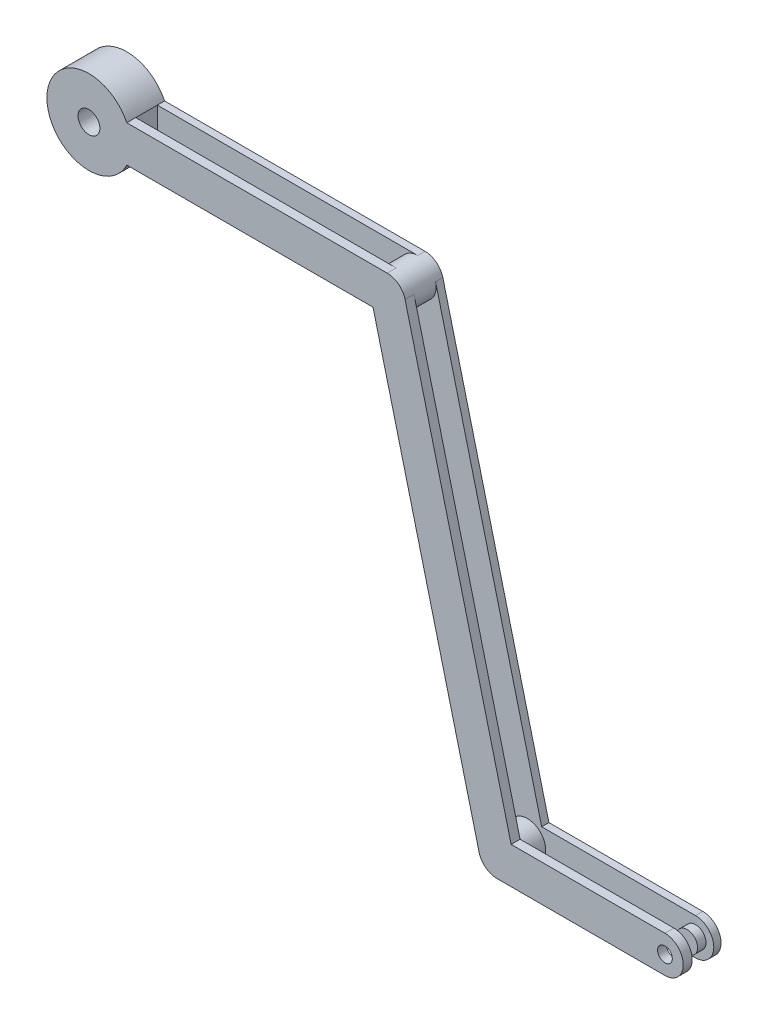
ISO-10303-21;
HEADER;
FILE_DESCRIPTION(('STEP AP214'),'2;1');
FILE_NAME('part.step','',(''),(''),'','','');
FILE_SCHEMA(('AUTOMOTIVE_DESIGN { 1 0 10303 214 1 1 1 1 }'));
ENDSEC;
DATA;
#1=APPLICATION_CONTEXT('core data for automotive mechanical design processes');
#2=APPLICATION_PROTOCOL_DEFINITION('international standard','automotive_design',2000,#1);
#3=PRODUCT_CONTEXT('',#1,'mechanical');
#4=PRODUCT('Part','Part','',(#3));
#5=PRODUCT_RELATED_PRODUCT_CATEGORY('part','',(#4));
#6=PRODUCT_DEFINITION_FORMATION('','',#4);
#7=PRODUCT_DEFINITION_CONTEXT('part definition',#1,'design');
#8=PRODUCT_DEFINITION('design','',#6,#7);
#9=PRODUCT_DEFINITION_SHAPE('','',#8);
#10=(LENGTH_UNIT() NAMED_UNIT(*) SI_UNIT(.MILLI.,.METRE.));
#11=(NAMED_UNIT(*) PLANE_ANGLE_UNIT() SI_UNIT($,.RADIAN.));
#12=(NAMED_UNIT(*) SI_UNIT($,.STERADIAN.) SOLID_ANGLE_UNIT());
#13=UNCERTAINTY_MEASURE_WITH_UNIT(LENGTH_MEASURE(1.E-05),#10,'distance_accuracy_value','');
#14=(GEOMETRIC_REPRESENTATION_CONTEXT(3) GLOBAL_UNCERTAINTY_ASSIGNED_CONTEXT((#13)) GLOBAL_UNIT_ASSIGNED_CONTEXT((#10,
#11,#12)) REPRESENTATION_CONTEXT('',''));
#15=CARTESIAN_POINT('',(0.,0.,0.));
#16=DIRECTION('',(0.,0.,1.));
#17=DIRECTION('',(1.,0.,0.));
#18=AXIS2_PLACEMENT_3D('',#15,#16,#17);
#19=CARTESIAN_POINT('',(0.,-107.358898943541,9.));
#20=DIRECTION('',(0.,1.,0.));
#21=DIRECTION('',(0.,0.,1.));
#22=AXIS2_PLACEMENT_3D('',#19,#20,#21);
#23=PLANE('',#22);
#24=DIRECTION('',(0.,0.,-1.));
#25=VECTOR('',#24,1.);
#26=CARTESIAN_POINT('',(137.080968946948,-107.358898943541,9.));
#27=LINE('',#26,#25);
#28=CARTESIAN_POINT('',(137.080968946948,-107.358898943541,1.72985231859176));
#29=VERTEX_POINT('',#28);
#30=CARTESIAN_POINT('',(137.080968946948,-107.358898943541,0.));
#31=VERTEX_POINT('',#30);
#32=EDGE_CURVE('E249',#29,#31,#27,.T.);
#33=ORIENTED_EDGE('',*,*,#32,.F.);
#34=DIRECTION('',(-1.,0.,0.));
#35=VECTOR('',#34,1.);
#36=CARTESIAN_POINT('',(141.439867890489,-107.358898943541,1.72985231859176));
#37=LINE('',#36,#35);
#38=CARTESIAN_POINT('',(97.0809689469479,-107.358898943541,1.72985231859176));
#39=VERTEX_POINT('',#38);
#40=EDGE_CURVE('E332',#29,#39,#37,.T.);
#41=ORIENTED_EDGE('',*,*,#40,.T.);
#42=DIRECTION('',(0.,0.,-1.));
#43=VECTOR('',#42,1.);
#44=CARTESIAN_POINT('',(97.0809689469479,-107.358898943541,9.));
#45=LINE('',#44,#43);
#46=CARTESIAN_POINT('',(97.0809689469479,-107.358898943541,0.));
#47=VERTEX_POINT('',#46);
#48=EDGE_CURVE('E109',#39,#47,#45,.T.);
#49=ORIENTED_EDGE('',*,*,#48,.T.);
#50=DIRECTION('',(1.,0.,0.));
#51=VECTOR('',#50,1.);
#52=CARTESIAN_POINT('',(0.,-107.358898943541,0.));
#53=LINE('',#52,#51);
#54=EDGE_CURVE('E175',#47,#31,#53,.T.);
#55=ORIENTED_EDGE('',*,*,#54,.T.);
#56=EDGE_LOOP('',(#33,#41,#49,#55));
#57=FACE_BOUND('',#56,.T.);
#58=ADVANCED_FACE('F47',(#57),#23,.F.);
#59=CARTESIAN_POINT('',(137.080968946948,-103.,9.));
#60=DIRECTION('',(0.,0.,-1.));
#61=DIRECTION('',(-1.,0.,0.));
#62=AXIS2_PLACEMENT_3D('',#59,#60,#61);
#63=CYLINDRICAL_SURFACE('',#62,4.35889894354068);
#64=CARTESIAN_POINT('',(137.080968946948,-103.,1.72985231859176));
#65=DIRECTION('',(0.,0.,-1.));
#66=DIRECTION('',(-1.,0.,0.));
#67=AXIS2_PLACEMENT_3D('',#64,#65,#66);
#68=CIRCLE('',#67,4.35889894354068);
#69=CARTESIAN_POINT('',(137.080968946948,-98.6411010564593,1.72985231859176));
#70=VERTEX_POINT('',#69);
#71=EDGE_CURVE('E377',#70,#29,#68,.T.);
#72=ORIENTED_EDGE('',*,*,#71,.T.);
#73=ORIENTED_EDGE('',*,*,#32,.T.);
#74=CARTESIAN_POINT('',(137.080968946948,-103.,0.));
#75=DIRECTION('',(0.,0.,1.));
#76=DIRECTION('',(1.,0.,0.));
#77=AXIS2_PLACEMENT_3D('',#74,#75,#76);
#78=CIRCLE('',#77,4.35889894354068);
#79=CARTESIAN_POINT('',(137.080968946948,-98.6411010564593,0.));
#80=VERTEX_POINT('',#79);
#81=EDGE_CURVE('E178',#31,#80,#78,.T.);
#82=ORIENTED_EDGE('',*,*,#81,.T.);
#83=DIRECTION('',(0.,0.,-1.));
#84=VECTOR('',#83,1.);
#85=CARTESIAN_POINT('',(137.080968946948,-98.6411010564593,9.));
#86=LINE('',#85,#84);
#87=EDGE_CURVE('E244',#70,#80,#86,.T.);
#88=ORIENTED_EDGE('',*,*,#87,.F.);
#89=EDGE_LOOP('',(#72,#73,#82,#88));
#90=FACE_BOUND('',#89,.T.);
#91=ADVANCED_FACE('F453',(#90),#63,.T.);
#92=CARTESIAN_POINT('',(0.,-98.6411010564593,9.));
#93=DIRECTION('',(0.,1.,0.));
#94=DIRECTION('',(0.,0.,1.));
#95=AXIS2_PLACEMENT_3D('',#92,#93,#94);
#96=PLANE('',#95);
#97=DIRECTION('',(-1.,0.,0.));
#98=VECTOR('',#97,1.);
#99=CARTESIAN_POINT('',(0.,-98.6411010564593,1.72985231859176));
#100=LINE('',#99,#98);
#101=CARTESIAN_POINT('',(100.473705575307,-98.6411010564593,1.72985231859176));
#102=VERTEX_POINT('',#101);
#103=EDGE_CURVE('E373',#70,#102,#100,.T.);
#104=ORIENTED_EDGE('',*,*,#103,.F.);
#105=ORIENTED_EDGE('',*,*,#87,.T.);
#106=DIRECTION('',(1.,0.,0.));
#107=VECTOR('',#106,1.);
#108=CARTESIAN_POINT('',(0.,-98.6411010564593,0.));
#109=LINE('',#108,#107);
#110=CARTESIAN_POINT('',(100.473705575307,-98.6411010564593,0.));
#111=VERTEX_POINT('',#110);
#112=EDGE_CURVE('E183',#111,#80,#109,.T.);
#113=ORIENTED_EDGE('',*,*,#112,.F.);
#114=DIRECTION('',(0.,0.,-1.));
#115=VECTOR('',#114,1.);
#116=CARTESIAN_POINT('',(100.473705575307,-98.6411010564593,9.));
#117=LINE('',#116,#115);
#118=EDGE_CURVE('E239',#102,#111,#117,.T.);
#119=ORIENTED_EDGE('',*,*,#118,.F.);
#120=EDGE_LOOP('',(#104,#105,#113,#119));
#121=FACE_BOUND('',#120,.T.);
#122=ADVANCED_FACE('F451',(#121),#96,.T.);
#123=CARTESIAN_POINT('',(70.9475272540212,17.9648568463579,9.));
#124=DIRECTION('',(0.969405133703911,0.245466263972268,0.));
#125=DIRECTION('',(-0.245466263972268,0.969405133703911,0.));
#126=AXIS2_PLACEMENT_3D('',#123,#124,#125);
#127=PLANE('',#126);
#128=DIRECTION('',(-0.245466263972268,0.969405133703911,0.));
#129=VECTOR('',#128,1.);
#130=CARTESIAN_POINT('',(70.9475272540212,17.9648568463579,1.72985231859176));
#131=LINE('',#130,#129);
#132=CARTESIAN_POINT('',(75.2255390131649,1.0699626387036,1.72985231859176));
#133=VERTEX_POINT('',#132);
#134=EDGE_CURVE('E369',#102,#133,#131,.T.);
#135=ORIENTED_EDGE('',*,*,#134,.F.);
#136=ORIENTED_EDGE('',*,*,#118,.T.);
#137=DIRECTION('',(0.245466263972268,-0.969405133703911,0.));
#138=VECTOR('',#137,1.);
#139=CARTESIAN_POINT('',(70.9475272540212,17.9648568463579,0.));
#140=LINE('',#139,#138);
#141=CARTESIAN_POINT('',(75.2255390131649,1.0699626387036,0.));
#142=VERTEX_POINT('',#141);
#143=EDGE_CURVE('E187',#142,#111,#140,.T.);
#144=ORIENTED_EDGE('',*,*,#143,.F.);
#145=DIRECTION('',(0.,0.,-1.));
#146=VECTOR('',#145,1.);
#147=CARTESIAN_POINT('',(75.2255390131649,1.0699626387036,9.));
#148=LINE('',#147,#146);
#149=EDGE_CURVE('E234',#133,#142,#148,.T.);
#150=ORIENTED_EDGE('',*,*,#149,.F.);
#151=EDGE_LOOP('',(#135,#136,#144,#150));
#152=FACE_BOUND('',#151,.T.);
#153=ADVANCED_FACE('F445',(#152),#127,.T.);
#154=CARTESIAN_POINT('',(0.,4.35889894354067,9.));
#155=DIRECTION('',(0.,1.,0.));
#156=DIRECTION('',(0.,0.,1.));
#157=AXIS2_PLACEMENT_3D('',#154,#155,#156);
#158=PLANE('',#157);
#159=DIRECTION('',(-1.,0.,0.));
#160=VECTOR('',#159,1.);
#161=CARTESIAN_POINT('',(141.439867890489,4.35889894354067,1.72985231859176));
#162=LINE('',#161,#160);
#163=CARTESIAN_POINT('',(71.,4.35889894354067,1.72985231859176));
#164=VERTEX_POINT('',#163);
#165=CARTESIAN_POINT('',(9.,4.35889894354067,1.72985231859176));
#166=VERTEX_POINT('',#165);
#167=EDGE_CURVE('E338',#164,#166,#162,.T.);
#168=ORIENTED_EDGE('',*,*,#167,.F.);
#169=DIRECTION('',(0.,0.,-1.));
#170=VECTOR('',#169,1.);
#171=CARTESIAN_POINT('',(71.,4.35889894354067,9.));
#172=LINE('',#171,#170);
#173=CARTESIAN_POINT('',(71.,4.35889894354067,0.));
#174=VERTEX_POINT('',#173);
#175=EDGE_CURVE('E229',#164,#174,#172,.T.);
#176=ORIENTED_EDGE('',*,*,#175,.T.);
#177=DIRECTION('',(1.,0.,0.));
#178=VECTOR('',#177,1.);
#179=CARTESIAN_POINT('',(0.,4.35889894354067,0.));
#180=LINE('',#179,#178);
#181=CARTESIAN_POINT('',(9.,4.35889894354067,0.));
#182=VERTEX_POINT('',#181);
#183=EDGE_CURVE('E195',#182,#174,#180,.T.);
#184=ORIENTED_EDGE('',*,*,#183,.F.);
#185=DIRECTION('',(0.,0.,-1.));
#186=VECTOR('',#185,1.);
#187=CARTESIAN_POINT('',(9.,4.35889894354067,9.));
#188=LINE('',#187,#186);
#189=EDGE_CURVE('E223',#166,#182,#188,.T.);
#190=ORIENTED_EDGE('',*,*,#189,.F.);
#191=EDGE_LOOP('',(#168,#176,#184,#190));
#192=FACE_BOUND('',#191,.T.);
#193=ADVANCED_FACE('F435',(#192),#158,.T.);
#194=CARTESIAN_POINT('',(0.,-4.35889894354067,9.));
#195=DIRECTION('',(0.,1.,0.));
#196=DIRECTION('',(-1.,0.,0.));
#197=AXIS2_PLACEMENT_3D('',#194,#195,#196);
#198=PLANE('',#197);
#199=DIRECTION('',(0.,0.,-1.));
#200=VECTOR('',#199,1.);
#201=CARTESIAN_POINT('',(67.6072633716404,-4.35889894354067,9.));
#202=LINE('',#201,#200);
#203=CARTESIAN_POINT('',(67.6072633716404,-4.35889894354067,1.72985231859176));
#204=VERTEX_POINT('',#203);
#205=CARTESIAN_POINT('',(67.6072633716404,-4.35889894354067,0.));
#206=VERTEX_POINT('',#205);
#207=EDGE_CURVE('E164',#204,#206,#202,.T.);
#208=ORIENTED_EDGE('',*,*,#207,.F.);
#209=DIRECTION('',(-1.,0.,0.));
#210=VECTOR('',#209,1.);
#211=CARTESIAN_POINT('',(0.,-4.35889894354067,1.72985231859176));
#212=LINE('',#211,#210);
#213=CARTESIAN_POINT('',(9.,-4.3588989435407,1.72985231859176));
#214=VERTEX_POINT('',#213);
#215=EDGE_CURVE('E365',#204,#214,#212,.T.);
#216=ORIENTED_EDGE('',*,*,#215,.T.);
#217=DIRECTION('',(0.,0.,-1.));
#218=VECTOR('',#217,1.);
#219=CARTESIAN_POINT('',(9.,-4.35889894354067,9.));
#220=LINE('',#219,#218);
#221=CARTESIAN_POINT('',(9.,-4.35889894354067,0.));
#222=VERTEX_POINT('',#221);
#223=EDGE_CURVE('E163',#214,#222,#220,.T.);
#224=ORIENTED_EDGE('',*,*,#223,.T.);
#225=DIRECTION('',(1.,0.,0.));
#226=VECTOR('',#225,1.);
#227=CARTESIAN_POINT('',(0.,-4.35889894354067,0.));
#228=LINE('',#227,#226);
#229=EDGE_CURVE('E203',#222,#206,#228,.T.);
#230=ORIENTED_EDGE('',*,*,#229,.T.);
#231=EDGE_LOOP('',(#208,#216,#224,#230));
#232=FACE_BOUND('',#231,.T.);
#233=ADVANCED_FACE('F426',(#232),#198,.F.);
#234=CARTESIAN_POINT('',(62.4964492276914,15.8249315689507,9.));
#235=DIRECTION('',(0.969405133703911,0.245466263972268,0.));
#236=DIRECTION('',(-0.245466263972268,0.969405133703911,0.));
#237=AXIS2_PLACEMENT_3D('',#234,#235,#236);
#238=PLANE('',#237);
#239=DIRECTION('',(0.,0.,-1.));
#240=VECTOR('',#239,1.);
#241=CARTESIAN_POINT('',(92.855429933783,-104.069962638704,9.));
#242=LINE('',#241,#240);
#243=CARTESIAN_POINT('',(92.855429933783,-104.069962638704,1.72985231859176));
#244=VERTEX_POINT('',#243);
#245=CARTESIAN_POINT('',(92.855429933783,-104.069962638704,0.));
#246=VERTEX_POINT('',#245);
#247=EDGE_CURVE('E101',#244,#246,#242,.T.);
#248=ORIENTED_EDGE('',*,*,#247,.F.);
#249=DIRECTION('',(-0.245466263972268,0.969405133703911,0.));
#250=VECTOR('',#249,1.);
#251=CARTESIAN_POINT('',(62.4964492276914,15.8249315689507,1.72985231859176));
#252=LINE('',#251,#250);
#253=EDGE_CURVE('E361',#244,#204,#252,.T.);
#254=ORIENTED_EDGE('',*,*,#253,.T.);
#255=ORIENTED_EDGE('',*,*,#207,.T.);
#256=DIRECTION('',(0.245466263972268,-0.969405133703911,0.));
#257=VECTOR('',#256,1.);
#258=CARTESIAN_POINT('',(62.4964492276914,15.8249315689507,0.));
#259=LINE('',#258,#257);
#260=EDGE_CURVE('E207',#206,#246,#259,.T.);
#261=ORIENTED_EDGE('',*,*,#260,.T.);
#262=EDGE_LOOP('',(#248,#254,#255,#261));
#263=FACE_BOUND('',#262,.T.);
#264=ADVANCED_FACE('F421',(#263),#238,.F.);
#265=CARTESIAN_POINT('',(97.0809689469479,-107.358898943541,9.));
#266=VERTEX_POINT('',#265);
#267=CARTESIAN_POINT('',(97.0809689469479,-107.358898943541,6.86957819147113));
#268=VERTEX_POINT('',#267);
#269=EDGE_CURVE('E214',#266,#268,#45,.T.);
#270=ORIENTED_EDGE('',*,*,#269,.T.);
#271=DIRECTION('',(1.,0.,0.));
#272=VECTOR('',#271,1.);
#273=CARTESIAN_POINT('',(9.,-107.358898943541,6.86957819147113));
#274=LINE('',#273,#272);
#275=CARTESIAN_POINT('',(137.080968946948,-107.358898943541,6.86957819147113));
#276=VERTEX_POINT('',#275);
#277=EDGE_CURVE('E274',#268,#276,#274,.T.);
#278=ORIENTED_EDGE('',*,*,#277,.T.);
#279=CARTESIAN_POINT('',(137.080968946948,-107.358898943541,9.));
#280=VERTEX_POINT('',#279);
#281=EDGE_CURVE('E250',#280,#276,#27,.T.);
#282=ORIENTED_EDGE('',*,*,#281,.F.);
#283=DIRECTION('',(1.,0.,0.));
#284=VECTOR('',#283,1.);
#285=CARTESIAN_POINT('',(0.,-107.358898943541,9.));
#286=LINE('',#285,#284);
#287=EDGE_CURVE('E213',#266,#280,#286,.T.);
#288=ORIENTED_EDGE('',*,*,#287,.F.);
#289=EDGE_LOOP('',(#270,#278,#282,#288));
#290=FACE_BOUND('',#289,.T.);
#291=ADVANCED_FACE('F49',(#290),#23,.F.);
#292=CARTESIAN_POINT('',(137.080968946948,-103.,6.86957819147113));
#293=DIRECTION('',(0.,0.,1.));
#294=DIRECTION('',(1.,0.,0.));
#295=AXIS2_PLACEMENT_3D('',#292,#293,#294);
#296=CIRCLE('',#295,4.35889894354068);
#297=CARTESIAN_POINT('',(137.080968946948,-98.6411010564593,6.86957819147113));
#298=VERTEX_POINT('',#297);
#299=EDGE_CURVE('E357',#276,#298,#296,.T.);
#300=ORIENTED_EDGE('',*,*,#299,.T.);
#301=CARTESIAN_POINT('',(137.080968946948,-98.6411010564593,9.));
#302=VERTEX_POINT('',#301);
#303=EDGE_CURVE('E245',#302,#298,#86,.T.);
#304=ORIENTED_EDGE('',*,*,#303,.F.);
#305=CARTESIAN_POINT('',(137.080968946948,-103.,9.));
#306=DIRECTION('',(0.,0.,1.));
#307=DIRECTION('',(1.,0.,0.));
#308=AXIS2_PLACEMENT_3D('',#305,#306,#307);
#309=CIRCLE('',#308,4.35889894354068);
#310=EDGE_CURVE('E117',#280,#302,#309,.T.);
#311=ORIENTED_EDGE('',*,*,#310,.F.);
#312=ORIENTED_EDGE('',*,*,#281,.T.);
#313=EDGE_LOOP('',(#300,#304,#311,#312));
#314=FACE_BOUND('',#313,.T.);
#315=ADVANCED_FACE('F456',(#314),#63,.T.);
#316=DIRECTION('',(1.,0.,0.));
#317=VECTOR('',#316,1.);
#318=CARTESIAN_POINT('',(0.,-98.6411010564593,6.86957819147113));
#319=LINE('',#318,#317);
#320=CARTESIAN_POINT('',(100.473705575307,-98.6411010564593,6.86957819147113));
#321=VERTEX_POINT('',#320);
#322=EDGE_CURVE('E353',#321,#298,#319,.T.);
#323=ORIENTED_EDGE('',*,*,#322,.F.);
#324=CARTESIAN_POINT('',(100.473705575307,-98.6411010564593,9.));
#325=VERTEX_POINT('',#324);
#326=EDGE_CURVE('E240',#325,#321,#117,.T.);
#327=ORIENTED_EDGE('',*,*,#326,.F.);
#328=DIRECTION('',(1.,0.,0.));
#329=VECTOR('',#328,1.);
#330=CARTESIAN_POINT('',(0.,-98.6411010564593,9.));
#331=LINE('',#330,#329);
#332=EDGE_CURVE('E288',#325,#302,#331,.T.);
#333=ORIENTED_EDGE('',*,*,#332,.T.);
#334=ORIENTED_EDGE('',*,*,#303,.T.);
#335=EDGE_LOOP('',(#323,#327,#333,#334));
#336=FACE_BOUND('',#335,.T.);
#337=ADVANCED_FACE('F462',(#336),#96,.T.);
#338=DIRECTION('',(0.245466263972268,-0.969405133703911,0.));
#339=VECTOR('',#338,1.);
#340=CARTESIAN_POINT('',(70.9475272540212,17.9648568463579,6.86957819147113));
#341=LINE('',#340,#339);
#342=CARTESIAN_POINT('',(75.2255390131649,1.06996263870359,6.86957819147113));
#343=VERTEX_POINT('',#342);
#344=EDGE_CURVE('E350',#343,#321,#341,.T.);
#345=ORIENTED_EDGE('',*,*,#344,.F.);
#346=CARTESIAN_POINT('',(75.2255390131649,1.0699626387036,9.));
#347=VERTEX_POINT('',#346);
#348=EDGE_CURVE('E235',#347,#343,#148,.T.);
#349=ORIENTED_EDGE('',*,*,#348,.F.);
#350=DIRECTION('',(0.245466263972268,-0.969405133703911,0.));
#351=VECTOR('',#350,1.);
#352=CARTESIAN_POINT('',(70.9475272540212,17.9648568463579,9.));
#353=LINE('',#352,#351);
#354=EDGE_CURVE('E296',#347,#325,#353,.T.);
#355=ORIENTED_EDGE('',*,*,#354,.T.);
#356=ORIENTED_EDGE('',*,*,#326,.T.);
#357=EDGE_LOOP('',(#345,#349,#355,#356));
#358=FACE_BOUND('',#357,.T.);
#359=ADVANCED_FACE('F469',(#358),#127,.T.);
#360=CARTESIAN_POINT('',(71.,0.,9.));
#361=DIRECTION('',(0.,0.,-1.));
#362=DIRECTION('',(-1.,0.,0.));
#363=AXIS2_PLACEMENT_3D('',#360,#361,#362);
#364=CYLINDRICAL_SURFACE('',#363,4.35889894354068);
#365=ORIENTED_EDGE('',*,*,#348,.T.);
#366=CARTESIAN_POINT('',(71.,0.,6.86957819147113));
#367=DIRECTION('',(0.,0.,1.));
#368=DIRECTION('',(1.,0.,0.));
#369=AXIS2_PLACEMENT_3D('',#366,#367,#368);
#370=CIRCLE('',#369,4.35889894354068);
#371=CARTESIAN_POINT('',(71.,4.35889894354067,6.86957819147113));
#372=VERTEX_POINT('',#371);
#373=EDGE_CURVE('E253',#372,#343,#370,.T.);
#374=ORIENTED_EDGE('',*,*,#373,.F.);
#375=CARTESIAN_POINT('',(71.,4.35889894354067,9.));
#376=VERTEX_POINT('',#375);
#377=EDGE_CURVE('E230',#376,#372,#172,.T.);
#378=ORIENTED_EDGE('',*,*,#377,.F.);
#379=CARTESIAN_POINT('',(71.,0.,9.));
#380=DIRECTION('',(0.,0.,1.));
#381=DIRECTION('',(1.,0.,0.));
#382=AXIS2_PLACEMENT_3D('',#379,#380,#381);
#383=CIRCLE('',#382,4.35889894354068);
#384=EDGE_CURVE('E300',#347,#376,#383,.T.);
#385=ORIENTED_EDGE('',*,*,#384,.F.);
#386=EDGE_LOOP('',(#365,#374,#378,#385));
#387=FACE_BOUND('',#386,.T.);
#388=CARTESIAN_POINT('',(71.,0.,1.72985231859176));
#389=DIRECTION('',(0.,0.,-1.));
#390=DIRECTION('',(-1.,0.,0.));
#391=AXIS2_PLACEMENT_3D('',#388,#389,#390);
#392=CIRCLE('',#391,4.35889894354068);
#393=EDGE_CURVE('E494',#164,#133,#392,.F.);
#394=ORIENTED_EDGE('',*,*,#393,.T.);
#395=ORIENTED_EDGE('',*,*,#149,.T.);
#396=CARTESIAN_POINT('',(71.,0.,0.));
#397=DIRECTION('',(0.,0.,1.));
#398=DIRECTION('',(1.,0.,0.));
#399=AXIS2_PLACEMENT_3D('',#396,#397,#398);
#400=CIRCLE('',#399,4.35889894354068);
#401=EDGE_CURVE('E191',#142,#174,#400,.T.);
#402=ORIENTED_EDGE('',*,*,#401,.T.);
#403=ORIENTED_EDGE('',*,*,#175,.F.);
#404=EDGE_LOOP('',(#394,#395,#402,#403));
#405=FACE_BOUND('',#404,.T.);
#406=ADVANCED_FACE('F317',(#387,#405),#364,.T.);
#407=DIRECTION('',(1.,0.,0.));
#408=VECTOR('',#407,1.);
#409=CARTESIAN_POINT('',(9.,4.35889894354067,6.86957819147113));
#410=LINE('',#409,#408);
#411=CARTESIAN_POINT('',(9.,4.35889894354067,6.86957819147113));
#412=VERTEX_POINT('',#411);
#413=EDGE_CURVE('E327',#412,#372,#410,.T.);
#414=ORIENTED_EDGE('',*,*,#413,.F.);
#415=CARTESIAN_POINT('',(9.,4.35889894354067,9.));
#416=VERTEX_POINT('',#415);
#417=EDGE_CURVE('E225',#416,#412,#188,.T.);
#418=ORIENTED_EDGE('',*,*,#417,.F.);
#419=DIRECTION('',(1.,0.,0.));
#420=VECTOR('',#419,1.);
#421=CARTESIAN_POINT('',(0.,4.35889894354067,9.));
#422=LINE('',#421,#420);
#423=EDGE_CURVE('E303',#416,#376,#422,.T.);
#424=ORIENTED_EDGE('',*,*,#423,.T.);
#425=ORIENTED_EDGE('',*,*,#377,.T.);
#426=EDGE_LOOP('',(#414,#418,#424,#425));
#427=FACE_BOUND('',#426,.T.);
#428=ADVANCED_FACE('F309',(#427),#158,.T.);
#429=CARTESIAN_POINT('',(0.,0.,9.));
#430=DIRECTION('',(0.,0.,-1.));
#431=DIRECTION('',(-1.,0.,0.));
#432=AXIS2_PLACEMENT_3D('',#429,#430,#431);
#433=CYLINDRICAL_SURFACE('',#432,10.);
#434=CARTESIAN_POINT('',(0.,0.,0.));
#435=DIRECTION('',(0.,0.,1.));
#436=DIRECTION('',(1.,0.,0.));
#437=AXIS2_PLACEMENT_3D('',#434,#435,#436);
#438=CIRCLE('',#437,10.);
#439=EDGE_CURVE('E199',#182,#222,#438,.T.);
#440=ORIENTED_EDGE('',*,*,#439,.T.);
#441=ORIENTED_EDGE('',*,*,#223,.F.);
#442=CARTESIAN_POINT('',(9.,-4.3588989435407,6.86957819147113));
#443=VERTEX_POINT('',#442);
#444=EDGE_CURVE('E224',#443,#214,#220,.T.);
#445=ORIENTED_EDGE('',*,*,#444,.F.);
#446=CARTESIAN_POINT('',(9.,-4.35889894354067,9.));
#447=VERTEX_POINT('',#446);
#448=EDGE_CURVE('E220',#447,#443,#220,.T.);
#449=ORIENTED_EDGE('',*,*,#448,.F.);
#450=CARTESIAN_POINT('',(0.,0.,9.));
#451=DIRECTION('',(0.,0.,1.));
#452=DIRECTION('',(1.,0.,0.));
#453=AXIS2_PLACEMENT_3D('',#450,#451,#452);
#454=CIRCLE('',#453,10.);
#455=EDGE_CURVE('E147',#416,#447,#454,.T.);
#456=ORIENTED_EDGE('',*,*,#455,.F.);
#457=ORIENTED_EDGE('',*,*,#417,.T.);
#458=DIRECTION('',(0.,0.,1.));
#459=VECTOR('',#458,1.);
#460=CARTESIAN_POINT('',(9.,4.35889894354067,1.72985231859176));
#461=LINE('',#460,#459);
#462=EDGE_CURVE('E333',#166,#412,#461,.T.);
#463=ORIENTED_EDGE('',*,*,#462,.F.);
#464=ORIENTED_EDGE('',*,*,#189,.T.);
#465=EDGE_LOOP('',(#440,#441,#445,#449,#456,#457,#463,#464));
#466=FACE_BOUND('',#465,.T.);
#467=ADVANCED_FACE('F516',(#466),#433,.T.);
#468=ORIENTED_EDGE('',*,*,#448,.T.);
#469=DIRECTION('',(1.,0.,0.));
#470=VECTOR('',#469,1.);
#471=CARTESIAN_POINT('',(0.,-4.35889894354067,6.86957819147113));
#472=LINE('',#471,#470);
#473=CARTESIAN_POINT('',(67.6072633716404,-4.35889894354067,6.86957819147113));
#474=VERTEX_POINT('',#473);
#475=EDGE_CURVE('E159',#443,#474,#472,.T.);
#476=ORIENTED_EDGE('',*,*,#475,.T.);
#477=CARTESIAN_POINT('',(67.6072633716404,-4.35889894354067,9.));
#478=VERTEX_POINT('',#477);
#479=EDGE_CURVE('E155',#478,#474,#202,.T.);
#480=ORIENTED_EDGE('',*,*,#479,.F.);
#481=DIRECTION('',(1.,0.,0.));
#482=VECTOR('',#481,1.);
#483=CARTESIAN_POINT('',(0.,-4.35889894354067,9.));
#484=LINE('',#483,#482);
#485=EDGE_CURVE('E138',#447,#478,#484,.T.);
#486=ORIENTED_EDGE('',*,*,#485,.F.);
#487=EDGE_LOOP('',(#468,#476,#480,#486));
#488=FACE_BOUND('',#487,.T.);
#489=ADVANCED_FACE('F156',(#488),#198,.F.);
#490=ORIENTED_EDGE('',*,*,#479,.T.);
#491=DIRECTION('',(0.245466263972268,-0.969405133703911,0.));
#492=VECTOR('',#491,1.);
#493=CARTESIAN_POINT('',(62.4964492276914,15.8249315689507,6.86957819147113));
#494=LINE('',#493,#492);
#495=CARTESIAN_POINT('',(92.855429933783,-104.069962638704,6.86957819147113));
#496=VERTEX_POINT('',#495);
#497=EDGE_CURVE('E270',#474,#496,#494,.T.);
#498=ORIENTED_EDGE('',*,*,#497,.T.);
#499=CARTESIAN_POINT('',(92.855429933783,-104.069962638704,9.));
#500=VERTEX_POINT('',#499);
#501=EDGE_CURVE('E168',#500,#496,#242,.T.);
#502=ORIENTED_EDGE('',*,*,#501,.F.);
#503=DIRECTION('',(0.245466263972268,-0.969405133703911,0.));
#504=VECTOR('',#503,1.);
#505=CARTESIAN_POINT('',(62.4964492276914,15.8249315689507,9.));
#506=LINE('',#505,#504);
#507=EDGE_CURVE('E143',#478,#500,#506,.T.);
#508=ORIENTED_EDGE('',*,*,#507,.F.);
#509=EDGE_LOOP('',(#490,#498,#502,#508));
#510=FACE_BOUND('',#509,.T.);
#511=ADVANCED_FACE('F166',(#510),#238,.F.);
#512=CARTESIAN_POINT('',(97.0809689469479,-103.,9.));
#513=DIRECTION('',(0.,0.,-1.));
#514=DIRECTION('',(-1.,0.,0.));
#515=AXIS2_PLACEMENT_3D('',#512,#513,#514);
#516=CYLINDRICAL_SURFACE('',#515,4.35889894354068);
#517=ORIENTED_EDGE('',*,*,#501,.T.);
#518=CARTESIAN_POINT('',(97.0809689469479,-103.,6.86957819147113));
#519=DIRECTION('',(0.,0.,1.));
#520=DIRECTION('',(1.,0.,0.));
#521=AXIS2_PLACEMENT_3D('',#518,#519,#520);
#522=CIRCLE('',#521,4.35889894354069);
#523=EDGE_CURVE('E57',#268,#496,#522,.T.);
#524=ORIENTED_EDGE('',*,*,#523,.F.);
#525=ORIENTED_EDGE('',*,*,#269,.F.);
#526=CARTESIAN_POINT('',(97.0809689469479,-103.,9.));
#527=DIRECTION('',(0.,0.,1.));
#528=DIRECTION('',(1.,0.,0.));
#529=AXIS2_PLACEMENT_3D('',#526,#527,#528);
#530=CIRCLE('',#529,4.35889894354068);
#531=EDGE_CURVE('E65',#500,#266,#530,.T.);
#532=ORIENTED_EDGE('',*,*,#531,.F.);
#533=EDGE_LOOP('',(#517,#524,#525,#532));
#534=FACE_BOUND('',#533,.T.);
#535=CARTESIAN_POINT('',(97.0809689469479,-103.,1.72985231859176));
#536=DIRECTION('',(0.,0.,-1.));
#537=DIRECTION('',(-1.,0.,0.));
#538=AXIS2_PLACEMENT_3D('',#535,#536,#537);
#539=CIRCLE('',#538,4.35889894354069);
#540=EDGE_CURVE('E490',#39,#244,#539,.F.);
#541=ORIENTED_EDGE('',*,*,#540,.T.);
#542=ORIENTED_EDGE('',*,*,#247,.T.);
#543=CARTESIAN_POINT('',(97.0809689469479,-103.,0.));
#544=DIRECTION('',(0.,0.,1.));
#545=DIRECTION('',(1.,0.,0.));
#546=AXIS2_PLACEMENT_3D('',#543,#544,#545);
#547=CIRCLE('',#546,4.35889894354068);
#548=EDGE_CURVE('E210',#246,#47,#547,.T.);
#549=ORIENTED_EDGE('',*,*,#548,.T.);
#550=ORIENTED_EDGE('',*,*,#48,.F.);
#551=EDGE_LOOP('',(#541,#542,#549,#550));
#552=FACE_BOUND('',#551,.T.);
#553=ADVANCED_FACE('F281',(#534,#552),#516,.T.);
#554=CARTESIAN_POINT('',(0.,0.,9.));
#555=DIRECTION('',(0.,0.,1.));
#556=DIRECTION('',(1.,0.,0.));
#557=AXIS2_PLACEMENT_3D('',#554,#555,#556);
#558=PLANE('',#557);
#559=CARTESIAN_POINT('',(137.080968946948,-103.,9.));
#560=DIRECTION('',(0.,0.,1.));
#561=DIRECTION('',(1.,0.,0.));
#562=AXIS2_PLACEMENT_3D('',#559,#560,#561);
#563=CIRCLE('',#562,1.75000000000001);
#564=CARTESIAN_POINT('',(138.830968946948,-103.,9.));
#565=VERTEX_POINT('',#564);
#566=EDGE_CURVE('E588',#565,#565,#563,.T.);
#567=ORIENTED_EDGE('',*,*,#566,.F.);
#568=EDGE_LOOP('',(#567));
#569=FACE_BOUND('',#568,.T.);
#570=ORIENTED_EDGE('',*,*,#507,.T.);
#571=ORIENTED_EDGE('',*,*,#531,.T.);
#572=ORIENTED_EDGE('',*,*,#287,.T.);
#573=ORIENTED_EDGE('',*,*,#310,.T.);
#574=ORIENTED_EDGE('',*,*,#332,.F.);
#575=ORIENTED_EDGE('',*,*,#354,.F.);
#576=ORIENTED_EDGE('',*,*,#384,.T.);
#577=ORIENTED_EDGE('',*,*,#423,.F.);
#578=ORIENTED_EDGE('',*,*,#455,.T.);
#579=ORIENTED_EDGE('',*,*,#485,.T.);
#580=EDGE_LOOP('',(#570,#571,#572,#573,#574,#575,#576,#577,#578,#579));
#581=FACE_BOUND('',#580,.T.);
#582=CARTESIAN_POINT('',(0.,0.,9.));
#583=DIRECTION('',(0.,0.,1.));
#584=DIRECTION('',(1.,0.,0.));
#585=AXIS2_PLACEMENT_3D('',#582,#583,#584);
#586=CIRCLE('',#585,2.6);
#587=CARTESIAN_POINT('',(2.6,0.,9.));
#588=VERTEX_POINT('',#587);
#589=EDGE_CURVE('E259',#588,#588,#586,.T.);
#590=ORIENTED_EDGE('',*,*,#589,.F.);
#591=EDGE_LOOP('',(#590));
#592=FACE_BOUND('',#591,.T.);
#593=ADVANCED_FACE('F140',(#569,#581,#592),#558,.T.);
#594=CARTESIAN_POINT('',(0.,0.,0.));
#595=DIRECTION('',(0.,0.,1.));
#596=DIRECTION('',(1.,0.,0.));
#597=AXIS2_PLACEMENT_3D('',#594,#595,#596);
#598=PLANE('',#597);
#599=CARTESIAN_POINT('',(0.,0.,0.));
#600=DIRECTION('',(0.,0.,-1.));
#601=DIRECTION('',(-1.,0.,0.));
#602=AXIS2_PLACEMENT_3D('',#599,#600,#601);
#603=CIRCLE('',#602,5.6);
#604=CARTESIAN_POINT('',(-5.6,0.,0.));
#605=VERTEX_POINT('',#604);
#606=EDGE_CURVE('E258',#605,#605,#603,.T.);
#607=ORIENTED_EDGE('',*,*,#606,.F.);
#608=EDGE_LOOP('',(#607));
#609=FACE_BOUND('',#608,.T.);
#610=ORIENTED_EDGE('',*,*,#54,.F.);
#611=ORIENTED_EDGE('',*,*,#548,.F.);
#612=ORIENTED_EDGE('',*,*,#260,.F.);
#613=ORIENTED_EDGE('',*,*,#229,.F.);
#614=ORIENTED_EDGE('',*,*,#439,.F.);
#615=ORIENTED_EDGE('',*,*,#183,.T.);
#616=ORIENTED_EDGE('',*,*,#401,.F.);
#617=ORIENTED_EDGE('',*,*,#143,.T.);
#618=ORIENTED_EDGE('',*,*,#112,.T.);
#619=ORIENTED_EDGE('',*,*,#81,.F.);
#620=EDGE_LOOP('',(#610,#611,#612,#613,#614,#615,#616,#617,#618,#619));
#621=FACE_BOUND('',#620,.T.);
#622=ADVANCED_FACE('F393',(#609,#621),#598,.F.);
#623=CARTESIAN_POINT('',(0.,0.,4.6));
#624=DIRECTION('',(0.,0.,-1.));
#625=DIRECTION('',(-1.,0.,0.));
#626=AXIS2_PLACEMENT_3D('',#623,#624,#625);
#627=CYLINDRICAL_SURFACE('',#626,5.6);
#628=CARTESIAN_POINT('',(0.,0.,4.6));
#629=DIRECTION('',(0.,0.,-1.));
#630=DIRECTION('',(-1.,0.,0.));
#631=AXIS2_PLACEMENT_3D('',#628,#629,#630);
#632=CIRCLE('',#631,5.6);
#633=CARTESIAN_POINT('',(-5.6,0.,4.6));
#634=VERTEX_POINT('',#633);
#635=EDGE_CURVE('E179',#634,#634,#632,.T.);
#636=ORIENTED_EDGE('',*,*,#635,.F.);
#637=EDGE_LOOP('',(#636));
#638=FACE_BOUND('',#637,.T.);
#639=ORIENTED_EDGE('',*,*,#606,.T.);
#640=EDGE_LOOP('',(#639));
#641=FACE_BOUND('',#640,.T.);
#642=ADVANCED_FACE('F391',(#638,#641),#627,.F.);
#643=CARTESIAN_POINT('',(0.,0.,4.6));
#644=DIRECTION('',(0.,0.,-1.));
#645=DIRECTION('',(-1.,0.,0.));
#646=AXIS2_PLACEMENT_3D('',#643,#644,#645);
#647=PLANE('',#646);
#648=CARTESIAN_POINT('',(0.,0.,4.6));
#649=DIRECTION('',(0.,0.,-1.));
#650=DIRECTION('',(-1.,0.,0.));
#651=AXIS2_PLACEMENT_3D('',#648,#649,#650);
#652=CIRCLE('',#651,2.6);
#653=CARTESIAN_POINT('',(-2.6,0.,4.6));
#654=VERTEX_POINT('',#653);
#655=EDGE_CURVE('E254',#654,#654,#652,.T.);
#656=ORIENTED_EDGE('',*,*,#655,.F.);
#657=EDGE_LOOP('',(#656));
#658=FACE_BOUND('',#657,.T.);
#659=ORIENTED_EDGE('',*,*,#635,.T.);
#660=EDGE_LOOP('',(#659));
#661=FACE_BOUND('',#660,.T.);
#662=ADVANCED_FACE('F558',(#658,#661),#647,.T.);
#663=CARTESIAN_POINT('',(0.,0.,0.));
#664=DIRECTION('',(0.,0.,1.));
#665=DIRECTION('',(1.,0.,0.));
#666=AXIS2_PLACEMENT_3D('',#663,#664,#665);
#667=CYLINDRICAL_SURFACE('',#666,2.6);
#668=ORIENTED_EDGE('',*,*,#655,.T.);
#669=EDGE_LOOP('',(#668));
#670=FACE_BOUND('',#669,.T.);
#671=ORIENTED_EDGE('',*,*,#589,.T.);
#672=EDGE_LOOP('',(#671));
#673=FACE_BOUND('',#672,.T.);
#674=ADVANCED_FACE('F562',(#670,#673),#667,.F.);
#675=CARTESIAN_POINT('',(9.,-107.358898943541,1.72985231859176));
#676=DIRECTION('',(-1.,0.,0.));
#677=DIRECTION('',(0.,0.,1.));
#678=AXIS2_PLACEMENT_3D('',#675,#676,#677);
#679=PLANE('',#678);
#680=DIRECTION('',(0.,1.,0.));
#681=VECTOR('',#680,1.);
#682=CARTESIAN_POINT('',(9.,-107.358898943541,1.72985231859176));
#683=LINE('',#682,#681);
#684=EDGE_CURVE('E344',#214,#166,#683,.T.);
#685=ORIENTED_EDGE('',*,*,#684,.T.);
#686=ORIENTED_EDGE('',*,*,#462,.T.);
#687=DIRECTION('',(0.,1.,0.));
#688=VECTOR('',#687,1.);
#689=CARTESIAN_POINT('',(9.,-107.358898943541,6.86957819147113));
#690=LINE('',#689,#688);
#691=EDGE_CURVE('E279',#443,#412,#690,.T.);
#692=ORIENTED_EDGE('',*,*,#691,.F.);
#693=ORIENTED_EDGE('',*,*,#444,.T.);
#694=EDGE_LOOP('',(#685,#686,#692,#693));
#695=FACE_BOUND('',#694,.T.);
#696=ADVANCED_FACE('F515',(#695),#679,.F.);
#697=CARTESIAN_POINT('',(141.439867890489,-107.358898943541,1.72985231859176));
#698=DIRECTION('',(0.,0.,-1.));
#699=DIRECTION('',(-1.,0.,0.));
#700=AXIS2_PLACEMENT_3D('',#697,#698,#699);
#701=PLANE('',#700);
#702=CARTESIAN_POINT('',(137.080968946948,-103.,1.72985231859176));
#703=DIRECTION('',(0.,0.,-1.));
#704=DIRECTION('',(-1.,0.,0.));
#705=AXIS2_PLACEMENT_3D('',#702,#703,#704);
#706=CIRCLE('',#705,2.5);
#707=CARTESIAN_POINT('',(134.580968946948,-103.,1.72985231859176));
#708=VERTEX_POINT('',#707);
#709=EDGE_CURVE('E11',#708,#708,#706,.F.);
#710=ORIENTED_EDGE('',*,*,#709,.F.);
#711=EDGE_LOOP('',(#710));
#712=FACE_BOUND('',#711,.T.);
#713=ORIENTED_EDGE('',*,*,#253,.F.);
#714=ORIENTED_EDGE('',*,*,#540,.F.);
#715=ORIENTED_EDGE('',*,*,#40,.F.);
#716=ORIENTED_EDGE('',*,*,#71,.F.);
#717=ORIENTED_EDGE('',*,*,#103,.T.);
#718=ORIENTED_EDGE('',*,*,#134,.T.);
#719=ORIENTED_EDGE('',*,*,#393,.F.);
#720=ORIENTED_EDGE('',*,*,#167,.T.);
#721=ORIENTED_EDGE('',*,*,#684,.F.);
#722=ORIENTED_EDGE('',*,*,#215,.F.);
#723=EDGE_LOOP('',(#713,#714,#715,#716,#717,#718,#719,#720,#721,#722));
#724=FACE_BOUND('',#723,.T.);
#725=ADVANCED_FACE('F488',(#712,#724),#701,.F.);
#726=CARTESIAN_POINT('',(9.,-107.358898943541,6.86957819147113));
#727=DIRECTION('',(0.,0.,1.));
#728=DIRECTION('',(1.,0.,0.));
#729=AXIS2_PLACEMENT_3D('',#726,#727,#728);
#730=PLANE('',#729);
#731=CARTESIAN_POINT('',(137.080968946948,-103.,6.86957819147113));
#732=DIRECTION('',(0.,0.,1.));
#733=DIRECTION('',(1.,0.,0.));
#734=AXIS2_PLACEMENT_3D('',#731,#732,#733);
#735=CIRCLE('',#734,1.75000000000001);
#736=CARTESIAN_POINT('',(138.830968946948,-103.,6.86957819147113));
#737=VERTEX_POINT('',#736);
#738=EDGE_CURVE('E501',#737,#737,#735,.F.);
#739=ORIENTED_EDGE('',*,*,#738,.F.);
#740=EDGE_LOOP('',(#739));
#741=FACE_BOUND('',#740,.T.);
#742=ORIENTED_EDGE('',*,*,#277,.F.);
#743=ORIENTED_EDGE('',*,*,#523,.T.);
#744=ORIENTED_EDGE('',*,*,#497,.F.);
#745=ORIENTED_EDGE('',*,*,#475,.F.);
#746=ORIENTED_EDGE('',*,*,#691,.T.);
#747=ORIENTED_EDGE('',*,*,#413,.T.);
#748=ORIENTED_EDGE('',*,*,#373,.T.);
#749=ORIENTED_EDGE('',*,*,#344,.T.);
#750=ORIENTED_EDGE('',*,*,#322,.T.);
#751=ORIENTED_EDGE('',*,*,#299,.F.);
#752=EDGE_LOOP('',(#742,#743,#744,#745,#746,#747,#748,#749,#750,#751));
#753=FACE_BOUND('',#752,.T.);
#754=ADVANCED_FACE('F269',(#741,#753),#730,.F.);
#755=CARTESIAN_POINT('',(137.080968946948,-103.,3.72985231859176));
#756=DIRECTION('',(0.,0.,-1.));
#757=DIRECTION('',(-1.,0.,0.));
#758=AXIS2_PLACEMENT_3D('',#755,#756,#757);
#759=CYLINDRICAL_SURFACE('',#758,2.5);
#760=CARTESIAN_POINT('',(137.080968946948,-103.,3.72985231859176));
#761=DIRECTION('',(0.,0.,1.));
#762=DIRECTION('',(1.,0.,0.));
#763=AXIS2_PLACEMENT_3D('',#760,#761,#762);
#764=CIRCLE('',#763,2.5);
#765=CARTESIAN_POINT('',(139.580968946948,-103.,3.72985231859176));
#766=VERTEX_POINT('',#765);
#767=EDGE_CURVE('E495',#766,#766,#764,.T.);
#768=ORIENTED_EDGE('',*,*,#767,.F.);
#769=EDGE_LOOP('',(#768));
#770=FACE_BOUND('',#769,.T.);
#771=ORIENTED_EDGE('',*,*,#709,.T.);
#772=EDGE_LOOP('',(#771));
#773=FACE_BOUND('',#772,.T.);
#774=ADVANCED_FACE('F571',(#770,#773),#759,.T.);
#775=CARTESIAN_POINT('',(137.080968946948,-103.,3.72985231859176));
#776=DIRECTION('',(0.,0.,1.));
#777=DIRECTION('',(1.,0.,0.));
#778=AXIS2_PLACEMENT_3D('',#775,#776,#777);
#779=PLANE('',#778);
#780=ORIENTED_EDGE('',*,*,#767,.T.);
#781=EDGE_LOOP('',(#780));
#782=FACE_BOUND('',#781,.T.);
#783=ADVANCED_FACE('F575',(#782),#779,.T.);
#784=CARTESIAN_POINT('',(137.080968946948,-103.,-0.000999999999999265));
#785=DIRECTION('',(0.,0.,1.));
#786=DIRECTION('',(1.,0.,0.));
#787=AXIS2_PLACEMENT_3D('',#784,#785,#786);
#788=CYLINDRICAL_SURFACE('',#787,1.75000000000001);
#789=ORIENTED_EDGE('',*,*,#566,.T.);
#790=EDGE_LOOP('',(#789));
#791=FACE_BOUND('',#790,.T.);
#792=ORIENTED_EDGE('',*,*,#738,.T.);
#793=EDGE_LOOP('',(#792));
#794=FACE_BOUND('',#793,.T.);
#795=ADVANCED_FACE('F579',(#791,#794),#788,.F.);
#796=CLOSED_SHELL('',(#58,#91,#122,#153,#193,#233,#264,#291,#315,#337,#359,#406,#428,#467,#489,
#511,#553,#593,#622,#642,#662,#674,#696,#725,#754,#774,#783,#795));
#797=MANIFOLD_SOLID_BREP('B2',#796);
#798=ADVANCED_BREP_SHAPE_REPRESENTATION('',(#18,#797),#14);
#799=SHAPE_DEFINITION_REPRESENTATION(#9,#798);
ENDSEC;
END-ISO-10303-21;
